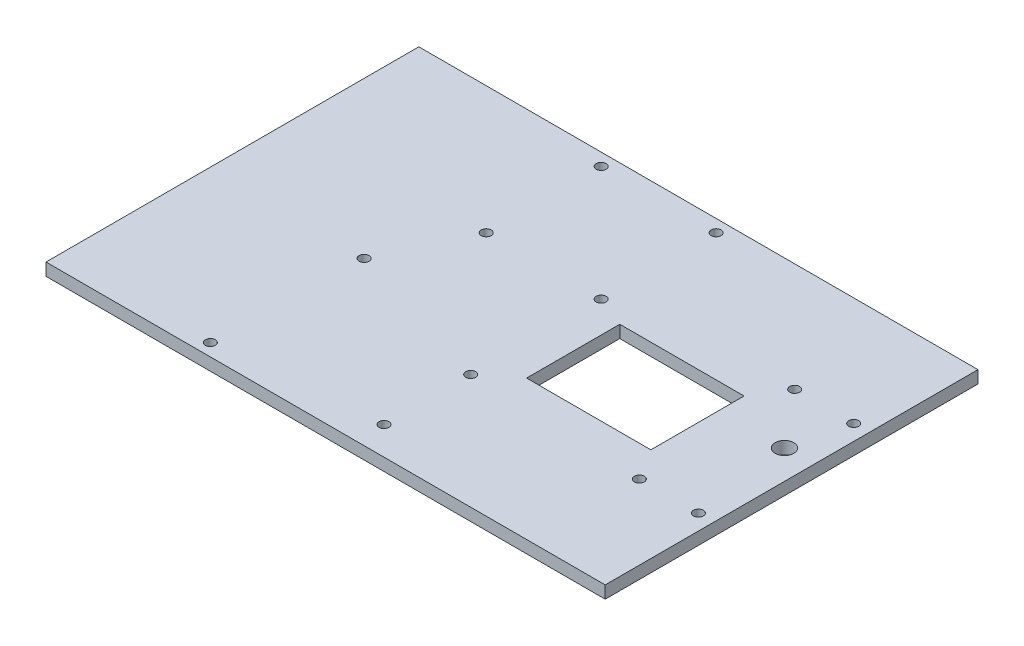
ISO-10303-21;
HEADER;
FILE_DESCRIPTION(('STEP AP214'),'2;1');
FILE_NAME('part.step','',(''),(''),'','','');
FILE_SCHEMA(('AUTOMOTIVE_DESIGN { 1 0 10303 214 1 1 1 1 }'));
ENDSEC;
DATA;
#1=APPLICATION_CONTEXT('core data for automotive mechanical design processes');
#2=APPLICATION_PROTOCOL_DEFINITION('international standard','automotive_design',2000,#1);
#3=PRODUCT_CONTEXT('',#1,'mechanical');
#4=PRODUCT('Part','Part','',(#3));
#5=PRODUCT_RELATED_PRODUCT_CATEGORY('part','',(#4));
#6=PRODUCT_DEFINITION_FORMATION('','',#4);
#7=PRODUCT_DEFINITION_CONTEXT('part definition',#1,'design');
#8=PRODUCT_DEFINITION('design','',#6,#7);
#9=PRODUCT_DEFINITION_SHAPE('','',#8);
#10=(LENGTH_UNIT() NAMED_UNIT(*) SI_UNIT(.MILLI.,.METRE.));
#11=(NAMED_UNIT(*) PLANE_ANGLE_UNIT() SI_UNIT($,.RADIAN.));
#12=(NAMED_UNIT(*) SI_UNIT($,.STERADIAN.) SOLID_ANGLE_UNIT());
#13=UNCERTAINTY_MEASURE_WITH_UNIT(LENGTH_MEASURE(1.E-05),#10,'distance_accuracy_value','');
#14=(GEOMETRIC_REPRESENTATION_CONTEXT(3) GLOBAL_UNCERTAINTY_ASSIGNED_CONTEXT((#13)) GLOBAL_UNIT_ASSIGNED_CONTEXT((#10,
#11,#12)) REPRESENTATION_CONTEXT('',''));
#15=CARTESIAN_POINT('',(0.,0.,0.));
#16=DIRECTION('',(0.,0.,1.));
#17=DIRECTION('',(1.,0.,0.));
#18=AXIS2_PLACEMENT_3D('',#15,#16,#17);
#19=CARTESIAN_POINT('',(90.,4.,60.));
#20=DIRECTION('',(-1.,0.,0.));
#21=DIRECTION('',(0.,0.,1.));
#22=AXIS2_PLACEMENT_3D('',#19,#20,#21);
#23=PLANE('',#22);
#24=DIRECTION('',(0.,0.,-1.));
#25=VECTOR('',#24,1.);
#26=CARTESIAN_POINT('',(90.,0.,60.));
#27=LINE('',#26,#25);
#28=CARTESIAN_POINT('',(90.,0.,60.));
#29=VERTEX_POINT('',#28);
#30=CARTESIAN_POINT('',(90.,0.,-60.));
#31=VERTEX_POINT('',#30);
#32=EDGE_CURVE('E175',#29,#31,#27,.T.);
#33=ORIENTED_EDGE('',*,*,#32,.T.);
#34=DIRECTION('',(0.,-1.,0.));
#35=VECTOR('',#34,1.);
#36=CARTESIAN_POINT('',(90.,4.,-60.));
#37=LINE('',#36,#35);
#38=CARTESIAN_POINT('',(90.,4.,-60.));
#39=VERTEX_POINT('',#38);
#40=EDGE_CURVE('E11',#39,#31,#37,.T.);
#41=ORIENTED_EDGE('',*,*,#40,.F.);
#42=DIRECTION('',(0.,0.,-1.));
#43=VECTOR('',#42,1.);
#44=CARTESIAN_POINT('',(90.,4.,60.));
#45=LINE('',#44,#43);
#46=CARTESIAN_POINT('',(90.,4.,60.));
#47=VERTEX_POINT('',#46);
#48=EDGE_CURVE('E178',#47,#39,#45,.T.);
#49=ORIENTED_EDGE('',*,*,#48,.F.);
#50=DIRECTION('',(0.,-1.,0.));
#51=VECTOR('',#50,1.);
#52=CARTESIAN_POINT('',(90.,4.,60.));
#53=LINE('',#52,#51);
#54=EDGE_CURVE('E188',#47,#29,#53,.T.);
#55=ORIENTED_EDGE('',*,*,#54,.T.);
#56=EDGE_LOOP('',(#33,#41,#49,#55));
#57=FACE_BOUND('',#56,.T.);
#58=ADVANCED_FACE('F43',(#57),#23,.F.);
#59=CARTESIAN_POINT('',(-90.,4.,-60.));
#60=DIRECTION('',(0.,0.,1.));
#61=DIRECTION('',(1.,0.,0.));
#62=AXIS2_PLACEMENT_3D('',#59,#60,#61);
#63=PLANE('',#62);
#64=DIRECTION('',(-1.,0.,0.));
#65=VECTOR('',#64,1.);
#66=CARTESIAN_POINT('',(-90.,0.,-60.));
#67=LINE('',#66,#65);
#68=CARTESIAN_POINT('',(-90.,0.,-60.));
#69=VERTEX_POINT('',#68);
#70=EDGE_CURVE('E191',#31,#69,#67,.T.);
#71=ORIENTED_EDGE('',*,*,#70,.T.);
#72=DIRECTION('',(0.,-1.,0.));
#73=VECTOR('',#72,1.);
#74=CARTESIAN_POINT('',(-90.,4.,-60.));
#75=LINE('',#74,#73);
#76=CARTESIAN_POINT('',(-90.,4.,-60.));
#77=VERTEX_POINT('',#76);
#78=EDGE_CURVE('E50',#77,#69,#75,.T.);
#79=ORIENTED_EDGE('',*,*,#78,.F.);
#80=DIRECTION('',(-1.,0.,0.));
#81=VECTOR('',#80,1.);
#82=CARTESIAN_POINT('',(-90.,4.,-60.));
#83=LINE('',#82,#81);
#84=EDGE_CURVE('E181',#39,#77,#83,.T.);
#85=ORIENTED_EDGE('',*,*,#84,.F.);
#86=ORIENTED_EDGE('',*,*,#40,.T.);
#87=EDGE_LOOP('',(#71,#79,#85,#86));
#88=FACE_BOUND('',#87,.T.);
#89=ADVANCED_FACE('F220',(#88),#63,.F.);
#90=CARTESIAN_POINT('',(-90.,4.,60.));
#91=DIRECTION('',(1.,0.,0.));
#92=DIRECTION('',(0.,0.,-1.));
#93=AXIS2_PLACEMENT_3D('',#90,#91,#92);
#94=PLANE('',#93);
#95=DIRECTION('',(0.,0.,1.));
#96=VECTOR('',#95,1.);
#97=CARTESIAN_POINT('',(-90.,0.,60.));
#98=LINE('',#97,#96);
#99=CARTESIAN_POINT('',(-90.,0.,60.));
#100=VERTEX_POINT('',#99);
#101=EDGE_CURVE('E193',#69,#100,#98,.T.);
#102=ORIENTED_EDGE('',*,*,#101,.T.);
#103=DIRECTION('',(0.,-1.,0.));
#104=VECTOR('',#103,1.);
#105=CARTESIAN_POINT('',(-90.,4.,60.));
#106=LINE('',#105,#104);
#107=CARTESIAN_POINT('',(-90.,4.,60.));
#108=VERTEX_POINT('',#107);
#109=EDGE_CURVE('E198',#108,#100,#106,.T.);
#110=ORIENTED_EDGE('',*,*,#109,.F.);
#111=DIRECTION('',(0.,0.,1.));
#112=VECTOR('',#111,1.);
#113=CARTESIAN_POINT('',(-90.,4.,60.));
#114=LINE('',#113,#112);
#115=EDGE_CURVE('E184',#77,#108,#114,.T.);
#116=ORIENTED_EDGE('',*,*,#115,.F.);
#117=ORIENTED_EDGE('',*,*,#78,.T.);
#118=EDGE_LOOP('',(#102,#110,#116,#117));
#119=FACE_BOUND('',#118,.T.);
#120=ADVANCED_FACE('F205',(#119),#94,.F.);
#121=CARTESIAN_POINT('',(-90.,4.,60.));
#122=DIRECTION('',(0.,0.,-1.));
#123=DIRECTION('',(-1.,0.,0.));
#124=AXIS2_PLACEMENT_3D('',#121,#122,#123);
#125=PLANE('',#124);
#126=DIRECTION('',(1.,0.,0.));
#127=VECTOR('',#126,1.);
#128=CARTESIAN_POINT('',(-90.,0.,60.));
#129=LINE('',#128,#127);
#130=EDGE_CURVE('E182',#100,#29,#129,.T.);
#131=ORIENTED_EDGE('',*,*,#130,.T.);
#132=ORIENTED_EDGE('',*,*,#54,.F.);
#133=DIRECTION('',(1.,0.,0.));
#134=VECTOR('',#133,1.);
#135=CARTESIAN_POINT('',(-90.,4.,60.));
#136=LINE('',#135,#134);
#137=EDGE_CURVE('E186',#108,#47,#136,.T.);
#138=ORIENTED_EDGE('',*,*,#137,.F.);
#139=ORIENTED_EDGE('',*,*,#109,.T.);
#140=EDGE_LOOP('',(#131,#132,#138,#139));
#141=FACE_BOUND('',#140,.T.);
#142=ADVANCED_FACE('F213',(#141),#125,.F.);
#143=CARTESIAN_POINT('',(0.,4.,0.));
#144=DIRECTION('',(0.,-1.,0.));
#145=DIRECTION('',(0.,0.,-1.));
#146=AXIS2_PLACEMENT_3D('',#143,#144,#145);
#147=PLANE('',#146);
#148=CARTESIAN_POINT('',(-39.8,4.,7.80000000000001));
#149=DIRECTION('',(0.,1.,0.));
#150=DIRECTION('',(0.,0.,1.));
#151=AXIS2_PLACEMENT_3D('',#148,#149,#150);
#152=CIRCLE('',#151,1.60000000000001);
#153=CARTESIAN_POINT('',(-39.8,4.,9.40000000000001));
#154=VERTEX_POINT('',#153);
#155=EDGE_CURVE('E306',#154,#154,#152,.T.);
#156=ORIENTED_EDGE('',*,*,#155,.F.);
#157=EDGE_LOOP('',(#156));
#158=FACE_BOUND('',#157,.T.);
#159=CARTESIAN_POINT('',(9.70000000000001,4.,23.));
#160=DIRECTION('',(0.,1.,0.));
#161=DIRECTION('',(0.,0.,1.));
#162=AXIS2_PLACEMENT_3D('',#159,#160,#161);
#163=CIRCLE('',#162,1.6);
#164=CARTESIAN_POINT('',(9.70000000000001,4.,24.6));
#165=VERTEX_POINT('',#164);
#166=EDGE_CURVE('E307',#165,#165,#163,.T.);
#167=ORIENTED_EDGE('',*,*,#166,.F.);
#168=EDGE_LOOP('',(#167));
#169=FACE_BOUND('',#168,.T.);
#170=CARTESIAN_POINT('',(9.70000000000001,4.,50.9));
#171=DIRECTION('',(0.,1.,0.));
#172=DIRECTION('',(0.,0.,1.));
#173=AXIS2_PLACEMENT_3D('',#170,#171,#172);
#174=CIRCLE('',#173,1.6);
#175=CARTESIAN_POINT('',(9.70000000000001,4.,52.5));
#176=VERTEX_POINT('',#175);
#177=EDGE_CURVE('E317',#176,#176,#174,.T.);
#178=ORIENTED_EDGE('',*,*,#177,.F.);
#179=EDGE_LOOP('',(#178));
#180=FACE_BOUND('',#179,.T.);
#181=CARTESIAN_POINT('',(-41.1,4.,56.));
#182=DIRECTION('',(0.,1.,0.));
#183=DIRECTION('',(0.,0.,1.));
#184=AXIS2_PLACEMENT_3D('',#181,#182,#183);
#185=CIRCLE('',#184,1.60000000000001);
#186=CARTESIAN_POINT('',(-41.1,4.,57.6));
#187=VERTEX_POINT('',#186);
#188=EDGE_CURVE('E323',#187,#187,#185,.T.);
#189=ORIENTED_EDGE('',*,*,#188,.F.);
#190=EDGE_LOOP('',(#189));
#191=FACE_BOUND('',#190,.T.);
#192=CARTESIAN_POINT('',(9.70000000000001,4.,-19.));
#193=DIRECTION('',(0.,1.,0.));
#194=DIRECTION('',(0.,0.,1.));
#195=AXIS2_PLACEMENT_3D('',#192,#193,#194);
#196=CIRCLE('',#195,1.6);
#197=CARTESIAN_POINT('',(9.70000000000001,4.,-17.4));
#198=VERTEX_POINT('',#197);
#199=EDGE_CURVE('E335',#198,#198,#196,.T.);
#200=ORIENTED_EDGE('',*,*,#199,.F.);
#201=EDGE_LOOP('',(#200));
#202=FACE_BOUND('',#201,.T.);
#203=CARTESIAN_POINT('',(-27.3,4.,-56.));
#204=DIRECTION('',(0.,1.,0.));
#205=DIRECTION('',(0.,0.,1.));
#206=AXIS2_PLACEMENT_3D('',#203,#204,#205);
#207=CIRCLE('',#206,1.60000000000001);
#208=CARTESIAN_POINT('',(-27.3,4.,-54.4));
#209=VERTEX_POINT('',#208);
#210=EDGE_CURVE('E341',#209,#209,#207,.T.);
#211=ORIENTED_EDGE('',*,*,#210,.F.);
#212=EDGE_LOOP('',(#211));
#213=FACE_BOUND('',#212,.T.);
#214=CARTESIAN_POINT('',(-27.3,4.,-19.));
#215=DIRECTION('',(0.,1.,0.));
#216=DIRECTION('',(0.,0.,1.));
#217=AXIS2_PLACEMENT_3D('',#214,#215,#216);
#218=CIRCLE('',#217,1.6);
#219=CARTESIAN_POINT('',(-27.3,4.,-17.4));
#220=VERTEX_POINT('',#219);
#221=EDGE_CURVE('E329',#220,#220,#218,.T.);
#222=ORIENTED_EDGE('',*,*,#221,.F.);
#223=EDGE_LOOP('',(#222));
#224=FACE_BOUND('',#223,.T.);
#225=CARTESIAN_POINT('',(9.70000000000001,4.,-56.));
#226=DIRECTION('',(0.,1.,0.));
#227=DIRECTION('',(0.,0.,1.));
#228=AXIS2_PLACEMENT_3D('',#225,#226,#227);
#229=CIRCLE('',#228,1.6);
#230=CARTESIAN_POINT('',(9.70000000000001,4.,-54.4));
#231=VERTEX_POINT('',#230);
#232=EDGE_CURVE('E131',#231,#231,#229,.T.);
#233=ORIENTED_EDGE('',*,*,#232,.F.);
#234=EDGE_LOOP('',(#233));
#235=FACE_BOUND('',#234,.T.);
#236=DIRECTION('',(-1.,0.,0.));
#237=VECTOR('',#236,1.);
#238=CARTESIAN_POINT('',(19.7,4.,-15.));
#239=LINE('',#238,#237);
#240=CARTESIAN_POINT('',(59.7,4.,-15.));
#241=VERTEX_POINT('',#240);
#242=CARTESIAN_POINT('',(19.7,4.,-15.));
#243=VERTEX_POINT('',#242);
#244=EDGE_CURVE('E137',#241,#243,#239,.T.);
#245=ORIENTED_EDGE('',*,*,#244,.F.);
#246=DIRECTION('',(0.,0.,-1.));
#247=VECTOR('',#246,1.);
#248=CARTESIAN_POINT('',(59.7,4.,15.));
#249=LINE('',#248,#247);
#250=CARTESIAN_POINT('',(59.7,4.,15.));
#251=VERTEX_POINT('',#250);
#252=EDGE_CURVE('E57',#251,#241,#249,.T.);
#253=ORIENTED_EDGE('',*,*,#252,.F.);
#254=DIRECTION('',(1.,0.,0.));
#255=VECTOR('',#254,1.);
#256=CARTESIAN_POINT('',(19.7,4.,15.));
#257=LINE('',#256,#255);
#258=CARTESIAN_POINT('',(19.7,4.,15.));
#259=VERTEX_POINT('',#258);
#260=EDGE_CURVE('E125',#259,#251,#257,.T.);
#261=ORIENTED_EDGE('',*,*,#260,.F.);
#262=DIRECTION('',(0.,0.,1.));
#263=VECTOR('',#262,1.);
#264=CARTESIAN_POINT('',(19.7,4.,15.));
#265=LINE('',#264,#263);
#266=EDGE_CURVE('E128',#243,#259,#265,.T.);
#267=ORIENTED_EDGE('',*,*,#266,.F.);
#268=EDGE_LOOP('',(#245,#253,#261,#267));
#269=FACE_BOUND('',#268,.T.);
#270=CARTESIAN_POINT('',(66.,4.,-25.));
#271=DIRECTION('',(0.,1.,0.));
#272=DIRECTION('',(0.,0.,1.));
#273=AXIS2_PLACEMENT_3D('',#270,#271,#272);
#274=CIRCLE('',#273,1.6);
#275=CARTESIAN_POINT('',(66.,4.,-23.4));
#276=VERTEX_POINT('',#275);
#277=EDGE_CURVE('E160',#276,#276,#274,.T.);
#278=ORIENTED_EDGE('',*,*,#277,.F.);
#279=EDGE_LOOP('',(#278));
#280=FACE_BOUND('',#279,.T.);
#281=CARTESIAN_POINT('',(85.,4.,25.));
#282=DIRECTION('',(0.,1.,0.));
#283=DIRECTION('',(0.,0.,1.));
#284=AXIS2_PLACEMENT_3D('',#281,#282,#283);
#285=CIRCLE('',#284,1.6);
#286=CARTESIAN_POINT('',(85.,4.,26.6));
#287=VERTEX_POINT('',#286);
#288=EDGE_CURVE('E167',#287,#287,#285,.T.);
#289=ORIENTED_EDGE('',*,*,#288,.F.);
#290=EDGE_LOOP('',(#289));
#291=FACE_BOUND('',#290,.T.);
#292=CARTESIAN_POINT('',(85.,4.,-25.));
#293=DIRECTION('',(0.,1.,0.));
#294=DIRECTION('',(0.,0.,1.));
#295=AXIS2_PLACEMENT_3D('',#292,#293,#294);
#296=CIRCLE('',#295,1.6);
#297=CARTESIAN_POINT('',(85.,4.,-23.4));
#298=VERTEX_POINT('',#297);
#299=EDGE_CURVE('E148',#298,#298,#296,.T.);
#300=ORIENTED_EDGE('',*,*,#299,.F.);
#301=EDGE_LOOP('',(#300));
#302=FACE_BOUND('',#301,.T.);
#303=CARTESIAN_POINT('',(80.7,4.,-7.));
#304=DIRECTION('',(0.,1.,0.));
#305=DIRECTION('',(0.,0.,1.));
#306=AXIS2_PLACEMENT_3D('',#303,#304,#305);
#307=CIRCLE('',#306,3.00000000000001);
#308=CARTESIAN_POINT('',(80.7,4.,-3.99999999999999));
#309=VERTEX_POINT('',#308);
#310=EDGE_CURVE('E155',#309,#309,#307,.T.);
#311=ORIENTED_EDGE('',*,*,#310,.F.);
#312=EDGE_LOOP('',(#311));
#313=FACE_BOUND('',#312,.T.);
#314=CARTESIAN_POINT('',(66.,4.,25.));
#315=DIRECTION('',(0.,1.,0.));
#316=DIRECTION('',(0.,0.,1.));
#317=AXIS2_PLACEMENT_3D('',#314,#315,#316);
#318=CIRCLE('',#317,1.6);
#319=CARTESIAN_POINT('',(66.,4.,26.6));
#320=VERTEX_POINT('',#319);
#321=EDGE_CURVE('E163',#320,#320,#318,.T.);
#322=ORIENTED_EDGE('',*,*,#321,.F.);
#323=EDGE_LOOP('',(#322));
#324=FACE_BOUND('',#323,.T.);
#325=ORIENTED_EDGE('',*,*,#48,.T.);
#326=ORIENTED_EDGE('',*,*,#84,.T.);
#327=ORIENTED_EDGE('',*,*,#115,.T.);
#328=ORIENTED_EDGE('',*,*,#137,.T.);
#329=EDGE_LOOP('',(#325,#326,#327,#328));
#330=FACE_BOUND('',#329,.T.);
#331=ADVANCED_FACE('F219',(#158,#169,#180,#191,#202,#213,#224,#235,#269,#280,#291,#302,#313,
#324,#330),#147,.F.);
#332=CARTESIAN_POINT('',(0.,0.,0.));
#333=DIRECTION('',(0.,-1.,0.));
#334=DIRECTION('',(0.,0.,-1.));
#335=AXIS2_PLACEMENT_3D('',#332,#333,#334);
#336=PLANE('',#335);
#337=CARTESIAN_POINT('',(-39.8,0.,7.80000000000001));
#338=DIRECTION('',(0.,1.,0.));
#339=DIRECTION('',(0.,0.,1.));
#340=AXIS2_PLACEMENT_3D('',#337,#338,#339);
#341=CIRCLE('',#340,1.60000000000001);
#342=CARTESIAN_POINT('',(-39.8,0.,9.40000000000001));
#343=VERTEX_POINT('',#342);
#344=EDGE_CURVE('E303',#343,#343,#341,.T.);
#345=ORIENTED_EDGE('',*,*,#344,.T.);
#346=EDGE_LOOP('',(#345));
#347=FACE_BOUND('',#346,.T.);
#348=CARTESIAN_POINT('',(9.70000000000001,0.,23.));
#349=DIRECTION('',(0.,1.,0.));
#350=DIRECTION('',(0.,0.,1.));
#351=AXIS2_PLACEMENT_3D('',#348,#349,#350);
#352=CIRCLE('',#351,1.6);
#353=CARTESIAN_POINT('',(9.70000000000001,0.,24.6));
#354=VERTEX_POINT('',#353);
#355=EDGE_CURVE('E312',#354,#354,#352,.T.);
#356=ORIENTED_EDGE('',*,*,#355,.T.);
#357=EDGE_LOOP('',(#356));
#358=FACE_BOUND('',#357,.T.);
#359=CARTESIAN_POINT('',(9.70000000000001,0.,50.9));
#360=DIRECTION('',(0.,1.,0.));
#361=DIRECTION('',(0.,0.,1.));
#362=AXIS2_PLACEMENT_3D('',#359,#360,#361);
#363=CIRCLE('',#362,1.6);
#364=CARTESIAN_POINT('',(9.70000000000001,0.,52.5));
#365=VERTEX_POINT('',#364);
#366=EDGE_CURVE('E320',#365,#365,#363,.T.);
#367=ORIENTED_EDGE('',*,*,#366,.T.);
#368=EDGE_LOOP('',(#367));
#369=FACE_BOUND('',#368,.T.);
#370=CARTESIAN_POINT('',(-41.1,0.,56.));
#371=DIRECTION('',(0.,1.,0.));
#372=DIRECTION('',(0.,0.,1.));
#373=AXIS2_PLACEMENT_3D('',#370,#371,#372);
#374=CIRCLE('',#373,1.60000000000001);
#375=CARTESIAN_POINT('',(-41.1,0.,57.6));
#376=VERTEX_POINT('',#375);
#377=EDGE_CURVE('E326',#376,#376,#374,.T.);
#378=ORIENTED_EDGE('',*,*,#377,.T.);
#379=EDGE_LOOP('',(#378));
#380=FACE_BOUND('',#379,.T.);
#381=CARTESIAN_POINT('',(9.70000000000001,0.,-19.));
#382=DIRECTION('',(0.,1.,0.));
#383=DIRECTION('',(0.,0.,1.));
#384=AXIS2_PLACEMENT_3D('',#381,#382,#383);
#385=CIRCLE('',#384,1.6);
#386=CARTESIAN_POINT('',(9.70000000000001,0.,-17.4));
#387=VERTEX_POINT('',#386);
#388=EDGE_CURVE('E338',#387,#387,#385,.T.);
#389=ORIENTED_EDGE('',*,*,#388,.T.);
#390=EDGE_LOOP('',(#389));
#391=FACE_BOUND('',#390,.T.);
#392=CARTESIAN_POINT('',(-27.3,0.,-56.));
#393=DIRECTION('',(0.,1.,0.));
#394=DIRECTION('',(0.,0.,1.));
#395=AXIS2_PLACEMENT_3D('',#392,#393,#394);
#396=CIRCLE('',#395,1.60000000000001);
#397=CARTESIAN_POINT('',(-27.3,0.,-54.4));
#398=VERTEX_POINT('',#397);
#399=EDGE_CURVE('E332',#398,#398,#396,.T.);
#400=ORIENTED_EDGE('',*,*,#399,.T.);
#401=EDGE_LOOP('',(#400));
#402=FACE_BOUND('',#401,.T.);
#403=CARTESIAN_POINT('',(-27.3,0.,-19.));
#404=DIRECTION('',(0.,1.,0.));
#405=DIRECTION('',(0.,0.,1.));
#406=AXIS2_PLACEMENT_3D('',#403,#404,#405);
#407=CIRCLE('',#406,1.6);
#408=CARTESIAN_POINT('',(-27.3,0.,-17.4));
#409=VERTEX_POINT('',#408);
#410=EDGE_CURVE('E309',#409,#409,#407,.T.);
#411=ORIENTED_EDGE('',*,*,#410,.T.);
#412=EDGE_LOOP('',(#411));
#413=FACE_BOUND('',#412,.T.);
#414=CARTESIAN_POINT('',(9.70000000000001,0.,-56.));
#415=DIRECTION('',(0.,1.,0.));
#416=DIRECTION('',(0.,0.,1.));
#417=AXIS2_PLACEMENT_3D('',#414,#415,#416);
#418=CIRCLE('',#417,1.6);
#419=CARTESIAN_POINT('',(9.70000000000001,0.,-54.4));
#420=VERTEX_POINT('',#419);
#421=EDGE_CURVE('E138',#420,#420,#418,.T.);
#422=ORIENTED_EDGE('',*,*,#421,.T.);
#423=EDGE_LOOP('',(#422));
#424=FACE_BOUND('',#423,.T.);
#425=DIRECTION('',(0.,0.,-1.));
#426=VECTOR('',#425,1.);
#427=CARTESIAN_POINT('',(59.7,0.,15.));
#428=LINE('',#427,#426);
#429=CARTESIAN_POINT('',(59.7,0.,15.));
#430=VERTEX_POINT('',#429);
#431=CARTESIAN_POINT('',(59.7,0.,-15.));
#432=VERTEX_POINT('',#431);
#433=EDGE_CURVE('E109',#430,#432,#428,.T.);
#434=ORIENTED_EDGE('',*,*,#433,.T.);
#435=DIRECTION('',(-1.,0.,0.));
#436=VECTOR('',#435,1.);
#437=CARTESIAN_POINT('',(19.7,0.,-15.));
#438=LINE('',#437,#436);
#439=CARTESIAN_POINT('',(19.7,0.,-15.));
#440=VERTEX_POINT('',#439);
#441=EDGE_CURVE('E118',#432,#440,#438,.T.);
#442=ORIENTED_EDGE('',*,*,#441,.T.);
#443=DIRECTION('',(0.,0.,1.));
#444=VECTOR('',#443,1.);
#445=CARTESIAN_POINT('',(19.7,0.,15.));
#446=LINE('',#445,#444);
#447=CARTESIAN_POINT('',(19.7,0.,15.));
#448=VERTEX_POINT('',#447);
#449=EDGE_CURVE('E65',#440,#448,#446,.T.);
#450=ORIENTED_EDGE('',*,*,#449,.T.);
#451=DIRECTION('',(1.,0.,0.));
#452=VECTOR('',#451,1.);
#453=CARTESIAN_POINT('',(19.7,0.,15.));
#454=LINE('',#453,#452);
#455=EDGE_CURVE('E115',#448,#430,#454,.T.);
#456=ORIENTED_EDGE('',*,*,#455,.T.);
#457=EDGE_LOOP('',(#434,#442,#450,#456));
#458=FACE_BOUND('',#457,.T.);
#459=CARTESIAN_POINT('',(66.,0.,-25.));
#460=DIRECTION('',(0.,1.,0.));
#461=DIRECTION('',(0.,0.,1.));
#462=AXIS2_PLACEMENT_3D('',#459,#460,#461);
#463=CIRCLE('',#462,1.6);
#464=CARTESIAN_POINT('',(66.,0.,-23.4));
#465=VERTEX_POINT('',#464);
#466=EDGE_CURVE('E164',#465,#465,#463,.T.);
#467=ORIENTED_EDGE('',*,*,#466,.T.);
#468=EDGE_LOOP('',(#467));
#469=FACE_BOUND('',#468,.T.);
#470=CARTESIAN_POINT('',(85.,0.,25.));
#471=DIRECTION('',(0.,1.,0.));
#472=DIRECTION('',(0.,0.,1.));
#473=AXIS2_PLACEMENT_3D('',#470,#471,#472);
#474=CIRCLE('',#473,1.6);
#475=CARTESIAN_POINT('',(85.,0.,26.6));
#476=VERTEX_POINT('',#475);
#477=EDGE_CURVE('E151',#476,#476,#474,.T.);
#478=ORIENTED_EDGE('',*,*,#477,.T.);
#479=EDGE_LOOP('',(#478));
#480=FACE_BOUND('',#479,.T.);
#481=CARTESIAN_POINT('',(85.,0.,-25.));
#482=DIRECTION('',(0.,1.,0.));
#483=DIRECTION('',(0.,0.,1.));
#484=AXIS2_PLACEMENT_3D('',#481,#482,#483);
#485=CIRCLE('',#484,1.6);
#486=CARTESIAN_POINT('',(85.,0.,-23.4));
#487=VERTEX_POINT('',#486);
#488=EDGE_CURVE('E152',#487,#487,#485,.T.);
#489=ORIENTED_EDGE('',*,*,#488,.T.);
#490=EDGE_LOOP('',(#489));
#491=FACE_BOUND('',#490,.T.);
#492=CARTESIAN_POINT('',(80.7,0.,-7.));
#493=DIRECTION('',(0.,1.,0.));
#494=DIRECTION('',(0.,0.,1.));
#495=AXIS2_PLACEMENT_3D('',#492,#493,#494);
#496=CIRCLE('',#495,3.00000000000001);
#497=CARTESIAN_POINT('',(80.7,0.,-3.99999999999999));
#498=VERTEX_POINT('',#497);
#499=EDGE_CURVE('E144',#498,#498,#496,.T.);
#500=ORIENTED_EDGE('',*,*,#499,.T.);
#501=EDGE_LOOP('',(#500));
#502=FACE_BOUND('',#501,.T.);
#503=CARTESIAN_POINT('',(66.,0.,25.));
#504=DIRECTION('',(0.,1.,0.));
#505=DIRECTION('',(0.,0.,1.));
#506=AXIS2_PLACEMENT_3D('',#503,#504,#505);
#507=CIRCLE('',#506,1.6);
#508=CARTESIAN_POINT('',(66.,0.,26.6));
#509=VERTEX_POINT('',#508);
#510=EDGE_CURVE('E172',#509,#509,#507,.T.);
#511=ORIENTED_EDGE('',*,*,#510,.T.);
#512=EDGE_LOOP('',(#511));
#513=FACE_BOUND('',#512,.T.);
#514=ORIENTED_EDGE('',*,*,#32,.F.);
#515=ORIENTED_EDGE('',*,*,#130,.F.);
#516=ORIENTED_EDGE('',*,*,#101,.F.);
#517=ORIENTED_EDGE('',*,*,#70,.F.);
#518=EDGE_LOOP('',(#514,#515,#516,#517));
#519=FACE_BOUND('',#518,.T.);
#520=ADVANCED_FACE('F122',(#347,#358,#369,#380,#391,#402,#413,#424,#458,#469,#480,#491,#502,
#513,#519),#336,.T.);
#521=CARTESIAN_POINT('',(66.,0.,25.));
#522=DIRECTION('',(0.,1.,0.));
#523=DIRECTION('',(0.,0.,1.));
#524=AXIS2_PLACEMENT_3D('',#521,#522,#523);
#525=CYLINDRICAL_SURFACE('',#524,1.6);
#526=ORIENTED_EDGE('',*,*,#510,.F.);
#527=EDGE_LOOP('',(#526));
#528=FACE_BOUND('',#527,.T.);
#529=ORIENTED_EDGE('',*,*,#321,.T.);
#530=EDGE_LOOP('',(#529));
#531=FACE_BOUND('',#530,.T.);
#532=ADVANCED_FACE('F232',(#528,#531),#525,.F.);
#533=CARTESIAN_POINT('',(80.7,0.,-7.));
#534=DIRECTION('',(0.,1.,0.));
#535=DIRECTION('',(0.,0.,1.));
#536=AXIS2_PLACEMENT_3D('',#533,#534,#535);
#537=CYLINDRICAL_SURFACE('',#536,3.00000000000001);
#538=ORIENTED_EDGE('',*,*,#499,.F.);
#539=EDGE_LOOP('',(#538));
#540=FACE_BOUND('',#539,.T.);
#541=ORIENTED_EDGE('',*,*,#310,.T.);
#542=EDGE_LOOP('',(#541));
#543=FACE_BOUND('',#542,.T.);
#544=ADVANCED_FACE('F239',(#540,#543),#537,.F.);
#545=CARTESIAN_POINT('',(85.,0.,-25.));
#546=DIRECTION('',(0.,1.,0.));
#547=DIRECTION('',(0.,0.,1.));
#548=AXIS2_PLACEMENT_3D('',#545,#546,#547);
#549=CYLINDRICAL_SURFACE('',#548,1.6);
#550=ORIENTED_EDGE('',*,*,#488,.F.);
#551=EDGE_LOOP('',(#550));
#552=FACE_BOUND('',#551,.T.);
#553=ORIENTED_EDGE('',*,*,#299,.T.);
#554=EDGE_LOOP('',(#553));
#555=FACE_BOUND('',#554,.T.);
#556=ADVANCED_FACE('F245',(#552,#555),#549,.F.);
#557=CARTESIAN_POINT('',(85.,0.,25.));
#558=DIRECTION('',(0.,1.,0.));
#559=DIRECTION('',(0.,0.,1.));
#560=AXIS2_PLACEMENT_3D('',#557,#558,#559);
#561=CYLINDRICAL_SURFACE('',#560,1.6);
#562=ORIENTED_EDGE('',*,*,#477,.F.);
#563=EDGE_LOOP('',(#562));
#564=FACE_BOUND('',#563,.T.);
#565=ORIENTED_EDGE('',*,*,#288,.T.);
#566=EDGE_LOOP('',(#565));
#567=FACE_BOUND('',#566,.T.);
#568=ADVANCED_FACE('F241',(#564,#567),#561,.F.);
#569=CARTESIAN_POINT('',(66.,0.,-25.));
#570=DIRECTION('',(0.,1.,0.));
#571=DIRECTION('',(0.,0.,1.));
#572=AXIS2_PLACEMENT_3D('',#569,#570,#571);
#573=CYLINDRICAL_SURFACE('',#572,1.6);
#574=ORIENTED_EDGE('',*,*,#466,.F.);
#575=EDGE_LOOP('',(#574));
#576=FACE_BOUND('',#575,.T.);
#577=ORIENTED_EDGE('',*,*,#277,.T.);
#578=EDGE_LOOP('',(#577));
#579=FACE_BOUND('',#578,.T.);
#580=ADVANCED_FACE('F244',(#576,#579),#573,.F.);
#581=CARTESIAN_POINT('',(59.7,0.,15.));
#582=DIRECTION('',(1.,0.,0.));
#583=DIRECTION('',(0.,0.,-1.));
#584=AXIS2_PLACEMENT_3D('',#581,#582,#583);
#585=PLANE('',#584);
#586=ORIENTED_EDGE('',*,*,#252,.T.);
#587=DIRECTION('',(0.,1.,0.));
#588=VECTOR('',#587,1.);
#589=CARTESIAN_POINT('',(59.7,0.,-15.));
#590=LINE('',#589,#588);
#591=EDGE_CURVE('E105',#432,#241,#590,.T.);
#592=ORIENTED_EDGE('',*,*,#591,.F.);
#593=ORIENTED_EDGE('',*,*,#433,.F.);
#594=DIRECTION('',(0.,1.,0.));
#595=VECTOR('',#594,1.);
#596=CARTESIAN_POINT('',(59.7,0.,15.));
#597=LINE('',#596,#595);
#598=EDGE_CURVE('E142',#430,#251,#597,.T.);
#599=ORIENTED_EDGE('',*,*,#598,.T.);
#600=EDGE_LOOP('',(#586,#592,#593,#599));
#601=FACE_BOUND('',#600,.T.);
#602=ADVANCED_FACE('F107',(#601),#585,.F.);
#603=CARTESIAN_POINT('',(19.7,0.,15.));
#604=DIRECTION('',(0.,0.,1.));
#605=DIRECTION('',(1.,0.,0.));
#606=AXIS2_PLACEMENT_3D('',#603,#604,#605);
#607=PLANE('',#606);
#608=ORIENTED_EDGE('',*,*,#260,.T.);
#609=ORIENTED_EDGE('',*,*,#598,.F.);
#610=ORIENTED_EDGE('',*,*,#455,.F.);
#611=DIRECTION('',(0.,1.,0.));
#612=VECTOR('',#611,1.);
#613=CARTESIAN_POINT('',(19.7,0.,15.));
#614=LINE('',#613,#612);
#615=EDGE_CURVE('E145',#448,#259,#614,.T.);
#616=ORIENTED_EDGE('',*,*,#615,.T.);
#617=EDGE_LOOP('',(#608,#609,#610,#616));
#618=FACE_BOUND('',#617,.T.);
#619=ADVANCED_FACE('F258',(#618),#607,.F.);
#620=CARTESIAN_POINT('',(19.7,0.,15.));
#621=DIRECTION('',(-1.,0.,0.));
#622=DIRECTION('',(0.,0.,1.));
#623=AXIS2_PLACEMENT_3D('',#620,#621,#622);
#624=PLANE('',#623);
#625=ORIENTED_EDGE('',*,*,#266,.T.);
#626=ORIENTED_EDGE('',*,*,#615,.F.);
#627=ORIENTED_EDGE('',*,*,#449,.F.);
#628=DIRECTION('',(0.,1.,0.));
#629=VECTOR('',#628,1.);
#630=CARTESIAN_POINT('',(19.7,0.,-15.));
#631=LINE('',#630,#629);
#632=EDGE_CURVE('E114',#440,#243,#631,.T.);
#633=ORIENTED_EDGE('',*,*,#632,.T.);
#634=EDGE_LOOP('',(#625,#626,#627,#633));
#635=FACE_BOUND('',#634,.T.);
#636=ADVANCED_FACE('F262',(#635),#624,.F.);
#637=CARTESIAN_POINT('',(19.7,0.,-15.));
#638=DIRECTION('',(0.,0.,-1.));
#639=DIRECTION('',(-1.,0.,0.));
#640=AXIS2_PLACEMENT_3D('',#637,#638,#639);
#641=PLANE('',#640);
#642=ORIENTED_EDGE('',*,*,#244,.T.);
#643=ORIENTED_EDGE('',*,*,#632,.F.);
#644=ORIENTED_EDGE('',*,*,#441,.F.);
#645=ORIENTED_EDGE('',*,*,#591,.T.);
#646=EDGE_LOOP('',(#642,#643,#644,#645));
#647=FACE_BOUND('',#646,.T.);
#648=ADVANCED_FACE('F119',(#647),#641,.F.);
#649=CARTESIAN_POINT('',(9.70000000000001,0.,-56.));
#650=DIRECTION('',(0.,1.,0.));
#651=DIRECTION('',(0.,0.,1.));
#652=AXIS2_PLACEMENT_3D('',#649,#650,#651);
#653=CYLINDRICAL_SURFACE('',#652,1.6);
#654=ORIENTED_EDGE('',*,*,#421,.F.);
#655=EDGE_LOOP('',(#654));
#656=FACE_BOUND('',#655,.T.);
#657=ORIENTED_EDGE('',*,*,#232,.T.);
#658=EDGE_LOOP('',(#657));
#659=FACE_BOUND('',#658,.T.);
#660=ADVANCED_FACE('F261',(#656,#659),#653,.F.);
#661=CARTESIAN_POINT('',(-27.3,0.,-19.));
#662=DIRECTION('',(0.,1.,0.));
#663=DIRECTION('',(0.,0.,1.));
#664=AXIS2_PLACEMENT_3D('',#661,#662,#663);
#665=CYLINDRICAL_SURFACE('',#664,1.6);
#666=ORIENTED_EDGE('',*,*,#410,.F.);
#667=EDGE_LOOP('',(#666));
#668=FACE_BOUND('',#667,.T.);
#669=ORIENTED_EDGE('',*,*,#221,.T.);
#670=EDGE_LOOP('',(#669));
#671=FACE_BOUND('',#670,.T.);
#672=ADVANCED_FACE('F270',(#668,#671),#665,.F.);
#673=CARTESIAN_POINT('',(-27.3,0.,-56.));
#674=DIRECTION('',(0.,1.,0.));
#675=DIRECTION('',(0.,0.,1.));
#676=AXIS2_PLACEMENT_3D('',#673,#674,#675);
#677=CYLINDRICAL_SURFACE('',#676,1.60000000000001);
#678=ORIENTED_EDGE('',*,*,#399,.F.);
#679=EDGE_LOOP('',(#678));
#680=FACE_BOUND('',#679,.T.);
#681=ORIENTED_EDGE('',*,*,#210,.T.);
#682=EDGE_LOOP('',(#681));
#683=FACE_BOUND('',#682,.T.);
#684=ADVANCED_FACE('F272',(#680,#683),#677,.F.);
#685=CARTESIAN_POINT('',(9.70000000000001,0.,-19.));
#686=DIRECTION('',(0.,1.,0.));
#687=DIRECTION('',(0.,0.,1.));
#688=AXIS2_PLACEMENT_3D('',#685,#686,#687);
#689=CYLINDRICAL_SURFACE('',#688,1.6);
#690=ORIENTED_EDGE('',*,*,#388,.F.);
#691=EDGE_LOOP('',(#690));
#692=FACE_BOUND('',#691,.T.);
#693=ORIENTED_EDGE('',*,*,#199,.T.);
#694=EDGE_LOOP('',(#693));
#695=FACE_BOUND('',#694,.T.);
#696=ADVANCED_FACE('F275',(#692,#695),#689,.F.);
#697=CARTESIAN_POINT('',(-41.1,0.,56.));
#698=DIRECTION('',(0.,1.,0.));
#699=DIRECTION('',(0.,0.,1.));
#700=AXIS2_PLACEMENT_3D('',#697,#698,#699);
#701=CYLINDRICAL_SURFACE('',#700,1.60000000000001);
#702=ORIENTED_EDGE('',*,*,#377,.F.);
#703=EDGE_LOOP('',(#702));
#704=FACE_BOUND('',#703,.T.);
#705=ORIENTED_EDGE('',*,*,#188,.T.);
#706=EDGE_LOOP('',(#705));
#707=FACE_BOUND('',#706,.T.);
#708=ADVANCED_FACE('F279',(#704,#707),#701,.F.);
#709=CARTESIAN_POINT('',(9.70000000000001,0.,50.9));
#710=DIRECTION('',(0.,1.,0.));
#711=DIRECTION('',(0.,0.,1.));
#712=AXIS2_PLACEMENT_3D('',#709,#710,#711);
#713=CYLINDRICAL_SURFACE('',#712,1.6);
#714=ORIENTED_EDGE('',*,*,#366,.F.);
#715=EDGE_LOOP('',(#714));
#716=FACE_BOUND('',#715,.T.);
#717=ORIENTED_EDGE('',*,*,#177,.T.);
#718=EDGE_LOOP('',(#717));
#719=FACE_BOUND('',#718,.T.);
#720=ADVANCED_FACE('F286',(#716,#719),#713,.F.);
#721=CARTESIAN_POINT('',(9.70000000000001,0.,23.));
#722=DIRECTION('',(0.,1.,0.));
#723=DIRECTION('',(0.,0.,1.));
#724=AXIS2_PLACEMENT_3D('',#721,#722,#723);
#725=CYLINDRICAL_SURFACE('',#724,1.6);
#726=ORIENTED_EDGE('',*,*,#355,.F.);
#727=EDGE_LOOP('',(#726));
#728=FACE_BOUND('',#727,.T.);
#729=ORIENTED_EDGE('',*,*,#166,.T.);
#730=EDGE_LOOP('',(#729));
#731=FACE_BOUND('',#730,.T.);
#732=ADVANCED_FACE('F290',(#728,#731),#725,.F.);
#733=CARTESIAN_POINT('',(-39.8,0.,7.80000000000001));
#734=DIRECTION('',(0.,1.,0.));
#735=DIRECTION('',(0.,0.,1.));
#736=AXIS2_PLACEMENT_3D('',#733,#734,#735);
#737=CYLINDRICAL_SURFACE('',#736,1.60000000000001);
#738=ORIENTED_EDGE('',*,*,#344,.F.);
#739=EDGE_LOOP('',(#738));
#740=FACE_BOUND('',#739,.T.);
#741=ORIENTED_EDGE('',*,*,#155,.T.);
#742=EDGE_LOOP('',(#741));
#743=FACE_BOUND('',#742,.T.);
#744=ADVANCED_FACE('F294',(#740,#743),#737,.F.);
#745=CLOSED_SHELL('',(#58,#89,#120,#142,#331,#520,#532,#544,#556,#568,#580,#602,#619,#636,#648,
#660,#672,#684,#696,#708,#720,#732,#744));
#746=MANIFOLD_SOLID_BREP('B2',#745);
#747=ADVANCED_BREP_SHAPE_REPRESENTATION('',(#18,#746),#14);
#748=SHAPE_DEFINITION_REPRESENTATION(#9,#747);
ENDSEC;
END-ISO-10303-21;
